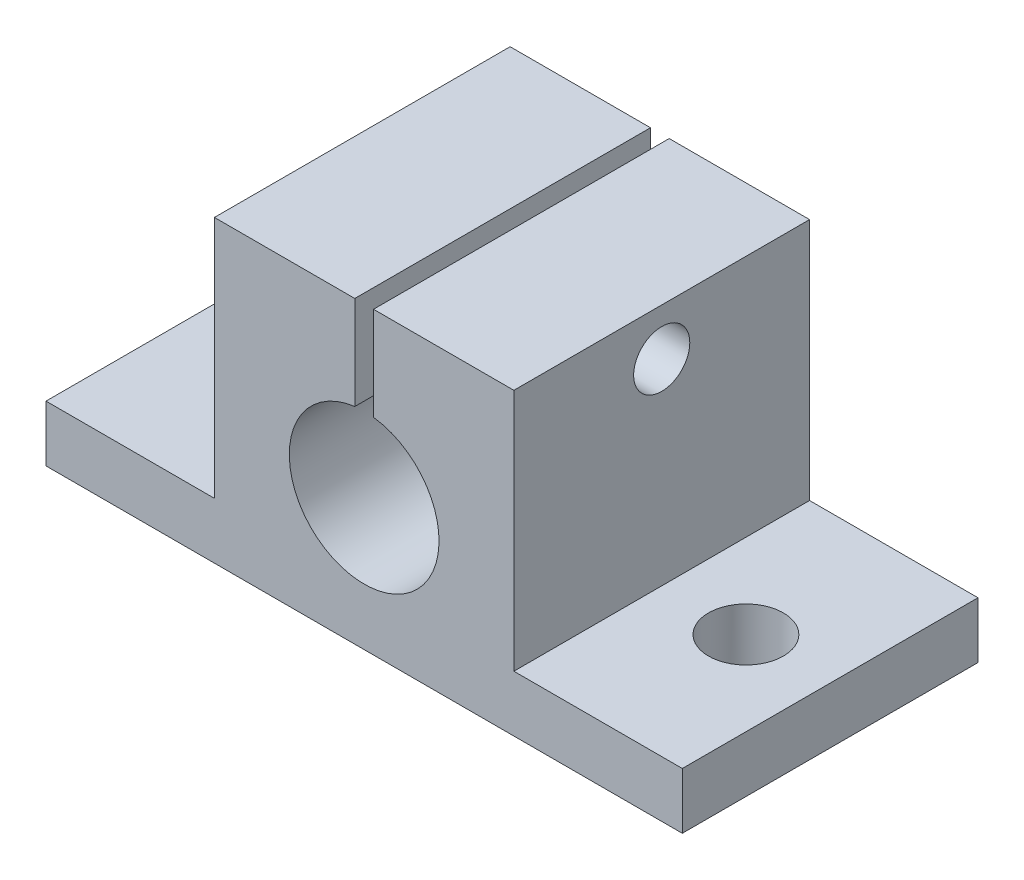
ISO-10303-21;
HEADER;
FILE_DESCRIPTION(('STEP AP214'),'2;1');
FILE_NAME('part.step','',(''),(''),'','','');
FILE_SCHEMA(('AUTOMOTIVE_DESIGN { 1 0 10303 214 1 1 1 1 }'));
ENDSEC;
DATA;
#1=APPLICATION_CONTEXT('core data for automotive mechanical design processes');
#2=APPLICATION_PROTOCOL_DEFINITION('international standard','automotive_design',2000,#1);
#3=PRODUCT_CONTEXT('',#1,'mechanical');
#4=PRODUCT('Part','Part','',(#3));
#5=PRODUCT_RELATED_PRODUCT_CATEGORY('part','',(#4));
#6=PRODUCT_DEFINITION_FORMATION('','',#4);
#7=PRODUCT_DEFINITION_CONTEXT('part definition',#1,'design');
#8=PRODUCT_DEFINITION('design','',#6,#7);
#9=PRODUCT_DEFINITION_SHAPE('','',#8);
#10=(LENGTH_UNIT() NAMED_UNIT(*) SI_UNIT(.MILLI.,.METRE.));
#11=(NAMED_UNIT(*) PLANE_ANGLE_UNIT() SI_UNIT($,.RADIAN.));
#12=(NAMED_UNIT(*) SI_UNIT($,.STERADIAN.) SOLID_ANGLE_UNIT());
#13=UNCERTAINTY_MEASURE_WITH_UNIT(LENGTH_MEASURE(1.E-05),#10,'distance_accuracy_value','');
#14=(GEOMETRIC_REPRESENTATION_CONTEXT(3) GLOBAL_UNCERTAINTY_ASSIGNED_CONTEXT((#13)) GLOBAL_UNIT_ASSIGNED_CONTEXT((#10,
#11,#12)) REPRESENTATION_CONTEXT('',''));
#15=CARTESIAN_POINT('',(0.,0.,0.));
#16=DIRECTION('',(0.,0.,1.));
#17=DIRECTION('',(1.,0.,0.));
#18=AXIS2_PLACEMENT_3D('',#15,#16,#17);
#19=CARTESIAN_POINT('',(0.,0.,-15.8));
#20=DIRECTION('',(-1.,0.,0.));
#21=DIRECTION('',(0.,0.,1.));
#22=AXIS2_PLACEMENT_3D('',#19,#20,#21);
#23=PLANE('',#22);
#24=DIRECTION('',(0.,-1.,0.));
#25=VECTOR('',#24,1.);
#26=CARTESIAN_POINT('',(0.,0.,0.));
#27=LINE('',#26,#25);
#28=CARTESIAN_POINT('',(0.,3.,0.));
#29=VERTEX_POINT('',#28);
#30=CARTESIAN_POINT('',(0.,0.,0.));
#31=VERTEX_POINT('',#30);
#32=EDGE_CURVE('E155',#29,#31,#27,.T.);
#33=ORIENTED_EDGE('',*,*,#32,.F.);
#34=DIRECTION('',(0.,0.,1.));
#35=VECTOR('',#34,1.);
#36=CARTESIAN_POINT('',(0.,3.,-15.8));
#37=LINE('',#36,#35);
#38=CARTESIAN_POINT('',(0.,3.,-15.8));
#39=VERTEX_POINT('',#38);
#40=EDGE_CURVE('E11',#39,#29,#37,.T.);
#41=ORIENTED_EDGE('',*,*,#40,.F.);
#42=DIRECTION('',(0.,-1.,0.));
#43=VECTOR('',#42,1.);
#44=CARTESIAN_POINT('',(0.,0.,-15.8));
#45=LINE('',#44,#43);
#46=CARTESIAN_POINT('',(0.,0.,-15.8));
#47=VERTEX_POINT('',#46);
#48=EDGE_CURVE('E188',#39,#47,#45,.T.);
#49=ORIENTED_EDGE('',*,*,#48,.T.);
#50=DIRECTION('',(0.,0.,1.));
#51=VECTOR('',#50,1.);
#52=CARTESIAN_POINT('',(0.,0.,-15.8));
#53=LINE('',#52,#51);
#54=EDGE_CURVE('E101',#47,#31,#53,.T.);
#55=ORIENTED_EDGE('',*,*,#54,.T.);
#56=EDGE_LOOP('',(#33,#41,#49,#55));
#57=FACE_BOUND('',#56,.T.);
#58=ADVANCED_FACE('F33',(#57),#23,.T.);
#59=CARTESIAN_POINT('',(0.,3.,-15.8));
#60=DIRECTION('',(0.,1.,0.));
#61=DIRECTION('',(0.,0.,1.));
#62=AXIS2_PLACEMENT_3D('',#59,#60,#61);
#63=PLANE('',#62);
#64=CARTESIAN_POINT('',(4.5,3.,-7.9));
#65=DIRECTION('',(0.,1.,0.));
#66=DIRECTION('',(0.,0.,1.));
#67=AXIS2_PLACEMENT_3D('',#64,#65,#66);
#68=CIRCLE('',#67,2.);
#69=CARTESIAN_POINT('',(4.5,3.,-5.9));
#70=VERTEX_POINT('',#69);
#71=EDGE_CURVE('E207',#70,#70,#68,.T.);
#72=ORIENTED_EDGE('',*,*,#71,.F.);
#73=EDGE_LOOP('',(#72));
#74=FACE_BOUND('',#73,.T.);
#75=DIRECTION('',(-1.,0.,0.));
#76=VECTOR('',#75,1.);
#77=CARTESIAN_POINT('',(0.,3.,0.));
#78=LINE('',#77,#76);
#79=CARTESIAN_POINT('',(9.,3.,0.));
#80=VERTEX_POINT('',#79);
#81=EDGE_CURVE('E186',#80,#29,#78,.T.);
#82=ORIENTED_EDGE('',*,*,#81,.F.);
#83=DIRECTION('',(0.,0.,1.));
#84=VECTOR('',#83,1.);
#85=CARTESIAN_POINT('',(9.,3.,-15.8));
#86=LINE('',#85,#84);
#87=CARTESIAN_POINT('',(9.,3.,-15.8));
#88=VERTEX_POINT('',#87);
#89=EDGE_CURVE('E42',#88,#80,#86,.T.);
#90=ORIENTED_EDGE('',*,*,#89,.F.);
#91=DIRECTION('',(-1.,0.,0.));
#92=VECTOR('',#91,1.);
#93=CARTESIAN_POINT('',(0.,3.,-15.8));
#94=LINE('',#93,#92);
#95=EDGE_CURVE('E145',#88,#39,#94,.T.);
#96=ORIENTED_EDGE('',*,*,#95,.T.);
#97=ORIENTED_EDGE('',*,*,#40,.T.);
#98=EDGE_LOOP('',(#82,#90,#96,#97));
#99=FACE_BOUND('',#98,.T.);
#100=ADVANCED_FACE('F265',(#74,#99),#63,.T.);
#101=CARTESIAN_POINT('',(9.,3.,-15.8));
#102=DIRECTION('',(-1.,0.,0.));
#103=DIRECTION('',(0.,0.,1.));
#104=AXIS2_PLACEMENT_3D('',#101,#102,#103);
#105=PLANE('',#104);
#106=CARTESIAN_POINT('',(9.,13.5,-7.9));
#107=DIRECTION('',(-1.,0.,0.));
#108=DIRECTION('',(0.,0.,1.));
#109=AXIS2_PLACEMENT_3D('',#106,#107,#108);
#110=CIRCLE('',#109,1.5);
#111=CARTESIAN_POINT('',(9.,13.5,-6.4));
#112=VERTEX_POINT('',#111);
#113=EDGE_CURVE('E314',#112,#112,#110,.T.);
#114=ORIENTED_EDGE('',*,*,#113,.F.);
#115=EDGE_LOOP('',(#114));
#116=FACE_BOUND('',#115,.T.);
#117=DIRECTION('',(0.,-1.,0.));
#118=VECTOR('',#117,1.);
#119=CARTESIAN_POINT('',(9.,3.,0.));
#120=LINE('',#119,#118);
#121=CARTESIAN_POINT('',(9.,16.,0.));
#122=VERTEX_POINT('',#121);
#123=EDGE_CURVE('E132',#122,#80,#120,.T.);
#124=ORIENTED_EDGE('',*,*,#123,.F.);
#125=DIRECTION('',(0.,0.,1.));
#126=VECTOR('',#125,1.);
#127=CARTESIAN_POINT('',(9.,16.,-15.8));
#128=LINE('',#127,#126);
#129=CARTESIAN_POINT('',(9.,16.,-15.8));
#130=VERTEX_POINT('',#129);
#131=EDGE_CURVE('E127',#130,#122,#128,.T.);
#132=ORIENTED_EDGE('',*,*,#131,.F.);
#133=DIRECTION('',(0.,-1.,0.));
#134=VECTOR('',#133,1.);
#135=CARTESIAN_POINT('',(9.,3.,-15.8));
#136=LINE('',#135,#134);
#137=EDGE_CURVE('E130',#130,#88,#136,.T.);
#138=ORIENTED_EDGE('',*,*,#137,.T.);
#139=ORIENTED_EDGE('',*,*,#89,.T.);
#140=EDGE_LOOP('',(#124,#132,#138,#139));
#141=FACE_BOUND('',#140,.T.);
#142=ADVANCED_FACE('F129',(#116,#141),#105,.T.);
#143=CARTESIAN_POINT('',(9.,16.,-15.8));
#144=DIRECTION('',(0.,1.,0.));
#145=DIRECTION('',(-1.,0.,0.));
#146=AXIS2_PLACEMENT_3D('',#143,#144,#145);
#147=PLANE('',#146);
#148=DIRECTION('',(-1.,0.,0.));
#149=VECTOR('',#148,1.);
#150=CARTESIAN_POINT('',(9.,16.,0.));
#151=LINE('',#150,#149);
#152=CARTESIAN_POINT('',(16.5,16.,0.));
#153=VERTEX_POINT('',#152);
#154=EDGE_CURVE('E183',#153,#122,#151,.T.);
#155=ORIENTED_EDGE('',*,*,#154,.F.);
#156=DIRECTION('',(0.,0.,1.));
#157=VECTOR('',#156,1.);
#158=CARTESIAN_POINT('',(16.5,16.,-15.8));
#159=LINE('',#158,#157);
#160=CARTESIAN_POINT('',(16.5,16.,-15.8));
#161=VERTEX_POINT('',#160);
#162=EDGE_CURVE('E137',#161,#153,#159,.T.);
#163=ORIENTED_EDGE('',*,*,#162,.F.);
#164=DIRECTION('',(-1.,0.,0.));
#165=VECTOR('',#164,1.);
#166=CARTESIAN_POINT('',(9.,16.,-15.8));
#167=LINE('',#166,#165);
#168=EDGE_CURVE('E143',#161,#130,#167,.T.);
#169=ORIENTED_EDGE('',*,*,#168,.T.);
#170=ORIENTED_EDGE('',*,*,#131,.T.);
#171=EDGE_LOOP('',(#155,#163,#169,#170));
#172=FACE_BOUND('',#171,.T.);
#173=ADVANCED_FACE('F147',(#172),#147,.T.);
#174=CARTESIAN_POINT('',(16.5,16.,-15.8));
#175=DIRECTION('',(1.,0.,0.));
#176=DIRECTION('',(0.,0.,-1.));
#177=AXIS2_PLACEMENT_3D('',#174,#175,#176);
#178=PLANE('',#177);
#179=CARTESIAN_POINT('',(16.5,13.5,-7.9));
#180=DIRECTION('',(1.,0.,0.));
#181=DIRECTION('',(0.,0.,-1.));
#182=AXIS2_PLACEMENT_3D('',#179,#180,#181);
#183=CIRCLE('',#182,1.5);
#184=CARTESIAN_POINT('',(16.5,13.5,-9.4));
#185=VERTEX_POINT('',#184);
#186=EDGE_CURVE('E316',#185,#185,#183,.T.);
#187=ORIENTED_EDGE('',*,*,#186,.F.);
#188=EDGE_LOOP('',(#187));
#189=FACE_BOUND('',#188,.T.);
#190=DIRECTION('',(0.,1.,0.));
#191=VECTOR('',#190,1.);
#192=CARTESIAN_POINT('',(16.5,16.,0.));
#193=LINE('',#192,#191);
#194=CARTESIAN_POINT('',(16.5,11.,0.));
#195=VERTEX_POINT('',#194);
#196=EDGE_CURVE('E180',#195,#153,#193,.T.);
#197=ORIENTED_EDGE('',*,*,#196,.F.);
#198=DIRECTION('',(0.,0.,1.));
#199=VECTOR('',#198,1.);
#200=CARTESIAN_POINT('',(16.5,11.,-15.8));
#201=LINE('',#200,#199);
#202=CARTESIAN_POINT('',(16.5,11.,-15.8));
#203=VERTEX_POINT('',#202);
#204=EDGE_CURVE('E192',#203,#195,#201,.T.);
#205=ORIENTED_EDGE('',*,*,#204,.F.);
#206=DIRECTION('',(0.,1.,0.));
#207=VECTOR('',#206,1.);
#208=CARTESIAN_POINT('',(16.5,16.,-15.8));
#209=LINE('',#208,#207);
#210=EDGE_CURVE('E148',#203,#161,#209,.T.);
#211=ORIENTED_EDGE('',*,*,#210,.T.);
#212=ORIENTED_EDGE('',*,*,#162,.T.);
#213=EDGE_LOOP('',(#197,#205,#211,#212));
#214=FACE_BOUND('',#213,.T.);
#215=ADVANCED_FACE('F280',(#189,#214),#178,.T.);
#216=CARTESIAN_POINT('',(17.,7.03137303340312,-15.8));
#217=DIRECTION('',(0.,0.,1.));
#218=DIRECTION('',(1.,0.,0.));
#219=AXIS2_PLACEMENT_3D('',#216,#217,#218);
#220=CYLINDRICAL_SURFACE('',#219,4.);
#221=CARTESIAN_POINT('',(17.,7.03137303340312,0.));
#222=DIRECTION('',(0.,0.,-1.));
#223=DIRECTION('',(-1.,0.,0.));
#224=AXIS2_PLACEMENT_3D('',#221,#222,#223);
#225=CIRCLE('',#224,4.);
#226=CARTESIAN_POINT('',(17.5,11.,0.));
#227=VERTEX_POINT('',#226);
#228=EDGE_CURVE('E177',#227,#195,#225,.T.);
#229=ORIENTED_EDGE('',*,*,#228,.F.);
#230=DIRECTION('',(0.,0.,1.));
#231=VECTOR('',#230,1.);
#232=CARTESIAN_POINT('',(17.5,11.,-15.8));
#233=LINE('',#232,#231);
#234=CARTESIAN_POINT('',(17.5,11.,-15.8));
#235=VERTEX_POINT('',#234);
#236=EDGE_CURVE('E194',#235,#227,#233,.T.);
#237=ORIENTED_EDGE('',*,*,#236,.F.);
#238=CARTESIAN_POINT('',(17.,7.03137303340312,-15.8));
#239=DIRECTION('',(0.,0.,-1.));
#240=DIRECTION('',(-1.,0.,0.));
#241=AXIS2_PLACEMENT_3D('',#238,#239,#240);
#242=CIRCLE('',#241,4.);
#243=EDGE_CURVE('E150',#235,#203,#242,.T.);
#244=ORIENTED_EDGE('',*,*,#243,.T.);
#245=ORIENTED_EDGE('',*,*,#204,.T.);
#246=EDGE_LOOP('',(#229,#237,#244,#245));
#247=FACE_BOUND('',#246,.T.);
#248=ADVANCED_FACE('F240',(#247),#220,.F.);
#249=CARTESIAN_POINT('',(17.5,16.,-15.8));
#250=DIRECTION('',(-1.,0.,0.));
#251=DIRECTION('',(0.,0.,1.));
#252=AXIS2_PLACEMENT_3D('',#249,#250,#251);
#253=PLANE('',#252);
#254=CARTESIAN_POINT('',(17.5,13.5,-7.9));
#255=DIRECTION('',(-1.,0.,0.));
#256=DIRECTION('',(0.,0.,1.));
#257=AXIS2_PLACEMENT_3D('',#254,#255,#256);
#258=CIRCLE('',#257,1.5);
#259=CARTESIAN_POINT('',(17.5,13.5,-6.4));
#260=VERTEX_POINT('',#259);
#261=EDGE_CURVE('E320',#260,#260,#258,.T.);
#262=ORIENTED_EDGE('',*,*,#261,.F.);
#263=EDGE_LOOP('',(#262));
#264=FACE_BOUND('',#263,.T.);
#265=DIRECTION('',(0.,-1.,0.));
#266=VECTOR('',#265,1.);
#267=CARTESIAN_POINT('',(17.5,16.,0.));
#268=LINE('',#267,#266);
#269=CARTESIAN_POINT('',(17.5,16.,0.));
#270=VERTEX_POINT('',#269);
#271=EDGE_CURVE('E174',#270,#227,#268,.T.);
#272=ORIENTED_EDGE('',*,*,#271,.F.);
#273=DIRECTION('',(0.,0.,1.));
#274=VECTOR('',#273,1.);
#275=CARTESIAN_POINT('',(17.5,16.,-15.8));
#276=LINE('',#275,#274);
#277=CARTESIAN_POINT('',(17.5,16.,-15.8));
#278=VERTEX_POINT('',#277);
#279=EDGE_CURVE('E196',#278,#270,#276,.T.);
#280=ORIENTED_EDGE('',*,*,#279,.F.);
#281=DIRECTION('',(0.,-1.,0.));
#282=VECTOR('',#281,1.);
#283=CARTESIAN_POINT('',(17.5,16.,-15.8));
#284=LINE('',#283,#282);
#285=EDGE_CURVE('E234',#278,#235,#284,.T.);
#286=ORIENTED_EDGE('',*,*,#285,.T.);
#287=ORIENTED_EDGE('',*,*,#236,.T.);
#288=EDGE_LOOP('',(#272,#280,#286,#287));
#289=FACE_BOUND('',#288,.T.);
#290=ADVANCED_FACE('F246',(#264,#289),#253,.T.);
#291=CARTESIAN_POINT('',(25.,16.,-15.8));
#292=DIRECTION('',(0.,1.,0.));
#293=DIRECTION('',(0.,0.,1.));
#294=AXIS2_PLACEMENT_3D('',#291,#292,#293);
#295=PLANE('',#294);
#296=DIRECTION('',(-1.,0.,0.));
#297=VECTOR('',#296,1.);
#298=CARTESIAN_POINT('',(25.,16.,0.));
#299=LINE('',#298,#297);
#300=CARTESIAN_POINT('',(25.,16.,0.));
#301=VERTEX_POINT('',#300);
#302=EDGE_CURVE('E171',#301,#270,#299,.T.);
#303=ORIENTED_EDGE('',*,*,#302,.F.);
#304=DIRECTION('',(0.,0.,1.));
#305=VECTOR('',#304,1.);
#306=CARTESIAN_POINT('',(25.,16.,-15.8));
#307=LINE('',#306,#305);
#308=CARTESIAN_POINT('',(25.,16.,-15.8));
#309=VERTEX_POINT('',#308);
#310=EDGE_CURVE('E198',#309,#301,#307,.T.);
#311=ORIENTED_EDGE('',*,*,#310,.F.);
#312=DIRECTION('',(-1.,0.,0.));
#313=VECTOR('',#312,1.);
#314=CARTESIAN_POINT('',(25.,16.,-15.8));
#315=LINE('',#314,#313);
#316=EDGE_CURVE('E231',#309,#278,#315,.T.);
#317=ORIENTED_EDGE('',*,*,#316,.T.);
#318=ORIENTED_EDGE('',*,*,#279,.T.);
#319=EDGE_LOOP('',(#303,#311,#317,#318));
#320=FACE_BOUND('',#319,.T.);
#321=ADVANCED_FACE('F249',(#320),#295,.T.);
#322=CARTESIAN_POINT('',(25.,16.,-15.8));
#323=DIRECTION('',(1.,0.,0.));
#324=DIRECTION('',(0.,0.,-1.));
#325=AXIS2_PLACEMENT_3D('',#322,#323,#324);
#326=PLANE('',#325);
#327=CARTESIAN_POINT('',(25.,13.5,-7.9));
#328=DIRECTION('',(1.,0.,0.));
#329=DIRECTION('',(0.,0.,-1.));
#330=AXIS2_PLACEMENT_3D('',#327,#328,#329);
#331=CIRCLE('',#330,1.5);
#332=CARTESIAN_POINT('',(25.,13.5,-9.4));
#333=VERTEX_POINT('',#332);
#334=EDGE_CURVE('E325',#333,#333,#331,.T.);
#335=ORIENTED_EDGE('',*,*,#334,.F.);
#336=EDGE_LOOP('',(#335));
#337=FACE_BOUND('',#336,.T.);
#338=DIRECTION('',(0.,1.,0.));
#339=VECTOR('',#338,1.);
#340=CARTESIAN_POINT('',(25.,16.,0.));
#341=LINE('',#340,#339);
#342=CARTESIAN_POINT('',(25.,3.,0.));
#343=VERTEX_POINT('',#342);
#344=EDGE_CURVE('E168',#343,#301,#341,.T.);
#345=ORIENTED_EDGE('',*,*,#344,.F.);
#346=DIRECTION('',(0.,0.,1.));
#347=VECTOR('',#346,1.);
#348=CARTESIAN_POINT('',(25.,3.,-15.8));
#349=LINE('',#348,#347);
#350=CARTESIAN_POINT('',(25.,3.,-15.8));
#351=VERTEX_POINT('',#350);
#352=EDGE_CURVE('E200',#351,#343,#349,.T.);
#353=ORIENTED_EDGE('',*,*,#352,.F.);
#354=DIRECTION('',(0.,1.,0.));
#355=VECTOR('',#354,1.);
#356=CARTESIAN_POINT('',(25.,16.,-15.8));
#357=LINE('',#356,#355);
#358=EDGE_CURVE('E228',#351,#309,#357,.T.);
#359=ORIENTED_EDGE('',*,*,#358,.T.);
#360=ORIENTED_EDGE('',*,*,#310,.T.);
#361=EDGE_LOOP('',(#345,#353,#359,#360));
#362=FACE_BOUND('',#361,.T.);
#363=ADVANCED_FACE('F254',(#337,#362),#326,.T.);
#364=CARTESIAN_POINT('',(25.,3.,-15.8));
#365=DIRECTION('',(0.,1.,0.));
#366=DIRECTION('',(0.,0.,1.));
#367=AXIS2_PLACEMENT_3D('',#364,#365,#366);
#368=PLANE('',#367);
#369=CARTESIAN_POINT('',(29.5,3.,-7.9));
#370=DIRECTION('',(0.,1.,0.));
#371=DIRECTION('',(0.,0.,1.));
#372=AXIS2_PLACEMENT_3D('',#369,#370,#371);
#373=CIRCLE('',#372,2.00000000000001);
#374=CARTESIAN_POINT('',(29.5,3.,-5.89999999999999));
#375=VERTEX_POINT('',#374);
#376=EDGE_CURVE('E215',#375,#375,#373,.T.);
#377=ORIENTED_EDGE('',*,*,#376,.F.);
#378=EDGE_LOOP('',(#377));
#379=FACE_BOUND('',#378,.T.);
#380=DIRECTION('',(-1.,0.,0.));
#381=VECTOR('',#380,1.);
#382=CARTESIAN_POINT('',(25.,3.,0.));
#383=LINE('',#382,#381);
#384=CARTESIAN_POINT('',(34.,3.,0.));
#385=VERTEX_POINT('',#384);
#386=EDGE_CURVE('E165',#385,#343,#383,.T.);
#387=ORIENTED_EDGE('',*,*,#386,.F.);
#388=DIRECTION('',(0.,0.,1.));
#389=VECTOR('',#388,1.);
#390=CARTESIAN_POINT('',(34.,3.,-15.8));
#391=LINE('',#390,#389);
#392=CARTESIAN_POINT('',(34.,3.,-15.8));
#393=VERTEX_POINT('',#392);
#394=EDGE_CURVE('E202',#393,#385,#391,.T.);
#395=ORIENTED_EDGE('',*,*,#394,.F.);
#396=DIRECTION('',(-1.,0.,0.));
#397=VECTOR('',#396,1.);
#398=CARTESIAN_POINT('',(25.,3.,-15.8));
#399=LINE('',#398,#397);
#400=EDGE_CURVE('E225',#393,#351,#399,.T.);
#401=ORIENTED_EDGE('',*,*,#400,.T.);
#402=ORIENTED_EDGE('',*,*,#352,.T.);
#403=EDGE_LOOP('',(#387,#395,#401,#402));
#404=FACE_BOUND('',#403,.T.);
#405=ADVANCED_FACE('F257',(#379,#404),#368,.T.);
#406=CARTESIAN_POINT('',(34.,3.,-15.8));
#407=DIRECTION('',(1.,0.,0.));
#408=DIRECTION('',(0.,0.,-1.));
#409=AXIS2_PLACEMENT_3D('',#406,#407,#408);
#410=PLANE('',#409);
#411=DIRECTION('',(0.,1.,0.));
#412=VECTOR('',#411,1.);
#413=CARTESIAN_POINT('',(34.,3.,0.));
#414=LINE('',#413,#412);
#415=CARTESIAN_POINT('',(34.,0.,0.));
#416=VERTEX_POINT('',#415);
#417=EDGE_CURVE('E162',#416,#385,#414,.T.);
#418=ORIENTED_EDGE('',*,*,#417,.F.);
#419=DIRECTION('',(0.,0.,1.));
#420=VECTOR('',#419,1.);
#421=CARTESIAN_POINT('',(34.,0.,-15.8));
#422=LINE('',#421,#420);
#423=CARTESIAN_POINT('',(34.,0.,-15.8));
#424=VERTEX_POINT('',#423);
#425=EDGE_CURVE('E204',#424,#416,#422,.T.);
#426=ORIENTED_EDGE('',*,*,#425,.F.);
#427=DIRECTION('',(0.,1.,0.));
#428=VECTOR('',#427,1.);
#429=CARTESIAN_POINT('',(34.,3.,-15.8));
#430=LINE('',#429,#428);
#431=EDGE_CURVE('E222',#424,#393,#430,.T.);
#432=ORIENTED_EDGE('',*,*,#431,.T.);
#433=ORIENTED_EDGE('',*,*,#394,.T.);
#434=EDGE_LOOP('',(#418,#426,#432,#433));
#435=FACE_BOUND('',#434,.T.);
#436=ADVANCED_FACE('F261',(#435),#410,.T.);
#437=CARTESIAN_POINT('',(0.,0.,-15.8));
#438=DIRECTION('',(0.,-1.,0.));
#439=DIRECTION('',(0.,0.,-1.));
#440=AXIS2_PLACEMENT_3D('',#437,#438,#439);
#441=PLANE('',#440);
#442=CARTESIAN_POINT('',(29.5,0.,-7.9));
#443=DIRECTION('',(0.,-1.,0.));
#444=DIRECTION('',(0.,0.,-1.));
#445=AXIS2_PLACEMENT_3D('',#442,#443,#444);
#446=CIRCLE('',#445,2.00000000000001);
#447=CARTESIAN_POINT('',(29.5,0.,-9.90000000000001));
#448=VERTEX_POINT('',#447);
#449=EDGE_CURVE('E36',#448,#448,#446,.T.);
#450=ORIENTED_EDGE('',*,*,#449,.F.);
#451=EDGE_LOOP('',(#450));
#452=FACE_BOUND('',#451,.T.);
#453=CARTESIAN_POINT('',(4.5,0.,-7.9));
#454=DIRECTION('',(0.,-1.,0.));
#455=DIRECTION('',(0.,0.,-1.));
#456=AXIS2_PLACEMENT_3D('',#453,#454,#455);
#457=CIRCLE('',#456,2.);
#458=CARTESIAN_POINT('',(4.5,0.,-9.9));
#459=VERTEX_POINT('',#458);
#460=EDGE_CURVE('E159',#459,#459,#457,.T.);
#461=ORIENTED_EDGE('',*,*,#460,.F.);
#462=EDGE_LOOP('',(#461));
#463=FACE_BOUND('',#462,.T.);
#464=DIRECTION('',(1.,0.,0.));
#465=VECTOR('',#464,1.);
#466=CARTESIAN_POINT('',(0.,0.,0.));
#467=LINE('',#466,#465);
#468=EDGE_CURVE('E158',#31,#416,#467,.T.);
#469=ORIENTED_EDGE('',*,*,#468,.F.);
#470=ORIENTED_EDGE('',*,*,#54,.F.);
#471=DIRECTION('',(1.,0.,0.));
#472=VECTOR('',#471,1.);
#473=CARTESIAN_POINT('',(0.,0.,-15.8));
#474=LINE('',#473,#472);
#475=EDGE_CURVE('E220',#47,#424,#474,.T.);
#476=ORIENTED_EDGE('',*,*,#475,.T.);
#477=ORIENTED_EDGE('',*,*,#425,.T.);
#478=EDGE_LOOP('',(#469,#470,#476,#477));
#479=FACE_BOUND('',#478,.T.);
#480=ADVANCED_FACE('F262',(#452,#463,#479),#441,.T.);
#481=CARTESIAN_POINT('',(17.,7.03137303340312,-15.8));
#482=DIRECTION('',(0.,0.,-1.));
#483=DIRECTION('',(-1.,0.,0.));
#484=AXIS2_PLACEMENT_3D('',#481,#482,#483);
#485=PLANE('',#484);
#486=ORIENTED_EDGE('',*,*,#48,.F.);
#487=ORIENTED_EDGE('',*,*,#95,.F.);
#488=ORIENTED_EDGE('',*,*,#137,.F.);
#489=ORIENTED_EDGE('',*,*,#168,.F.);
#490=ORIENTED_EDGE('',*,*,#210,.F.);
#491=ORIENTED_EDGE('',*,*,#243,.F.);
#492=ORIENTED_EDGE('',*,*,#285,.F.);
#493=ORIENTED_EDGE('',*,*,#316,.F.);
#494=ORIENTED_EDGE('',*,*,#358,.F.);
#495=ORIENTED_EDGE('',*,*,#400,.F.);
#496=ORIENTED_EDGE('',*,*,#431,.F.);
#497=ORIENTED_EDGE('',*,*,#475,.F.);
#498=EDGE_LOOP('',(#486,#487,#488,#489,#490,#491,#492,#493,#494,#495,#496,#497));
#499=FACE_BOUND('',#498,.T.);
#500=ADVANCED_FACE('F141',(#499),#485,.T.);
#501=CARTESIAN_POINT('',(17.,7.03137303340312,0.));
#502=DIRECTION('',(0.,0.,-1.));
#503=DIRECTION('',(-1.,0.,0.));
#504=AXIS2_PLACEMENT_3D('',#501,#502,#503);
#505=PLANE('',#504);
#506=ORIENTED_EDGE('',*,*,#32,.T.);
#507=ORIENTED_EDGE('',*,*,#468,.T.);
#508=ORIENTED_EDGE('',*,*,#417,.T.);
#509=ORIENTED_EDGE('',*,*,#386,.T.);
#510=ORIENTED_EDGE('',*,*,#344,.T.);
#511=ORIENTED_EDGE('',*,*,#302,.T.);
#512=ORIENTED_EDGE('',*,*,#271,.T.);
#513=ORIENTED_EDGE('',*,*,#228,.T.);
#514=ORIENTED_EDGE('',*,*,#196,.T.);
#515=ORIENTED_EDGE('',*,*,#154,.T.);
#516=ORIENTED_EDGE('',*,*,#123,.T.);
#517=ORIENTED_EDGE('',*,*,#81,.T.);
#518=EDGE_LOOP('',(#506,#507,#508,#509,#510,#511,#512,#513,#514,#515,#516,#517));
#519=FACE_BOUND('',#518,.T.);
#520=ADVANCED_FACE('F264',(#519),#505,.F.);
#521=CARTESIAN_POINT('',(4.5,-12.8,-7.9));
#522=DIRECTION('',(0.,1.,0.));
#523=DIRECTION('',(0.,0.,1.));
#524=AXIS2_PLACEMENT_3D('',#521,#522,#523);
#525=CYLINDRICAL_SURFACE('',#524,2.);
#526=ORIENTED_EDGE('',*,*,#460,.T.);
#527=EDGE_LOOP('',(#526));
#528=FACE_BOUND('',#527,.T.);
#529=ORIENTED_EDGE('',*,*,#71,.T.);
#530=EDGE_LOOP('',(#529));
#531=FACE_BOUND('',#530,.T.);
#532=ADVANCED_FACE('F310',(#528,#531),#525,.F.);
#533=CARTESIAN_POINT('',(29.5,-12.8,-7.9));
#534=DIRECTION('',(0.,1.,0.));
#535=DIRECTION('',(0.,0.,1.));
#536=AXIS2_PLACEMENT_3D('',#533,#534,#535);
#537=CYLINDRICAL_SURFACE('',#536,2.00000000000001);
#538=ORIENTED_EDGE('',*,*,#449,.T.);
#539=EDGE_LOOP('',(#538));
#540=FACE_BOUND('',#539,.T.);
#541=ORIENTED_EDGE('',*,*,#376,.T.);
#542=EDGE_LOOP('',(#541));
#543=FACE_BOUND('',#542,.T.);
#544=ADVANCED_FACE('F306',(#540,#543),#537,.F.);
#545=CARTESIAN_POINT('',(0.,13.5,-7.9));
#546=DIRECTION('',(1.,0.,0.));
#547=DIRECTION('',(0.,0.,-1.));
#548=AXIS2_PLACEMENT_3D('',#545,#546,#547);
#549=CYLINDRICAL_SURFACE('',#548,1.5);
#550=ORIENTED_EDGE('',*,*,#261,.T.);
#551=EDGE_LOOP('',(#550));
#552=FACE_BOUND('',#551,.T.);
#553=ORIENTED_EDGE('',*,*,#334,.T.);
#554=EDGE_LOOP('',(#553));
#555=FACE_BOUND('',#554,.T.);
#556=ADVANCED_FACE('F309',(#552,#555),#549,.F.);
#557=ORIENTED_EDGE('',*,*,#113,.T.);
#558=EDGE_LOOP('',(#557));
#559=FACE_BOUND('',#558,.T.);
#560=ORIENTED_EDGE('',*,*,#186,.T.);
#561=EDGE_LOOP('',(#560));
#562=FACE_BOUND('',#561,.T.);
#563=ADVANCED_FACE('F330',(#559,#562),#549,.F.);
#564=CLOSED_SHELL('',(#58,#100,#142,#173,#215,#248,#290,#321,#363,#405,#436,#480,#500,#520,#532,
#544,#556,#563));
#565=MANIFOLD_SOLID_BREP('B2',#564);
#566=ADVANCED_BREP_SHAPE_REPRESENTATION('',(#18,#565),#14);
#567=SHAPE_DEFINITION_REPRESENTATION(#9,#566);
ENDSEC;
END-ISO-10303-21;
